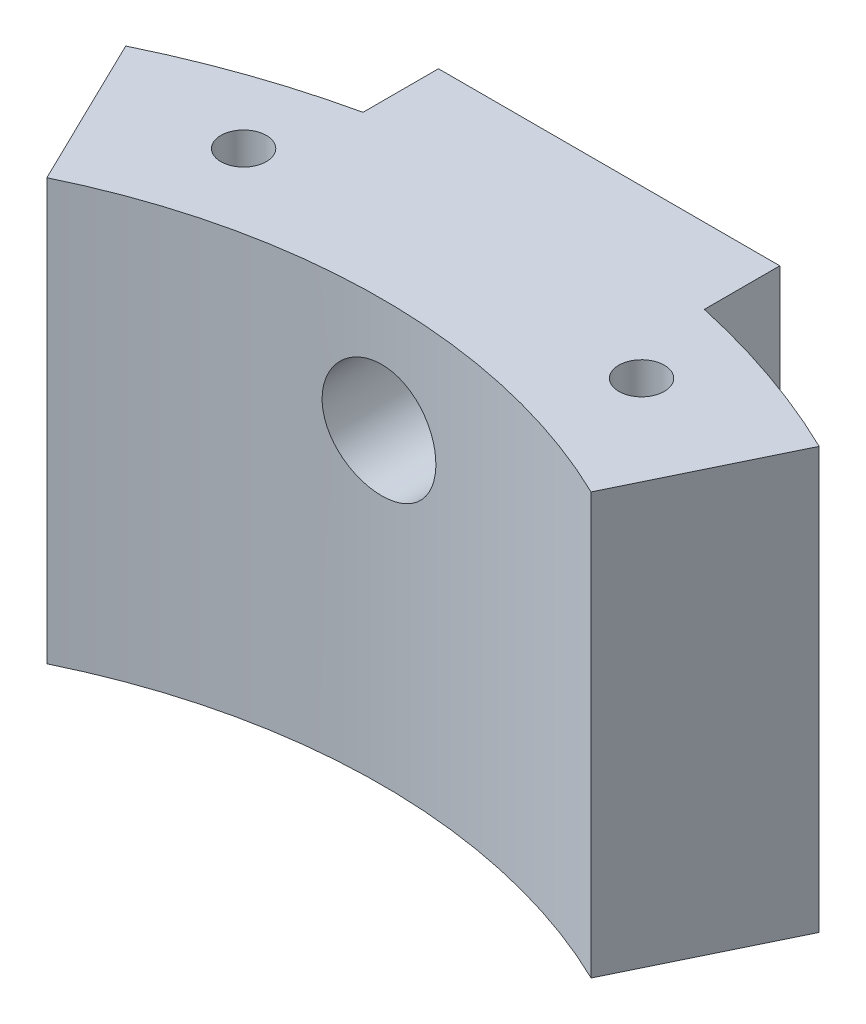
ISO-10303-21;
HEADER;
FILE_DESCRIPTION(('STEP AP214'),'2;1');
FILE_NAME('part.step','',(''),(''),'','','');
FILE_SCHEMA(('AUTOMOTIVE_DESIGN { 1 0 10303 214 1 1 1 1 }'));
ENDSEC;
DATA;
#1=APPLICATION_CONTEXT('core data for automotive mechanical design processes');
#2=APPLICATION_PROTOCOL_DEFINITION('international standard','automotive_design',2000,#1);
#3=PRODUCT_CONTEXT('',#1,'mechanical');
#4=PRODUCT('Part','Part','',(#3));
#5=PRODUCT_RELATED_PRODUCT_CATEGORY('part','',(#4));
#6=PRODUCT_DEFINITION_FORMATION('','',#4);
#7=PRODUCT_DEFINITION_CONTEXT('part definition',#1,'design');
#8=PRODUCT_DEFINITION('design','',#6,#7);
#9=PRODUCT_DEFINITION_SHAPE('','',#8);
#10=(LENGTH_UNIT() NAMED_UNIT(*) SI_UNIT(.MILLI.,.METRE.));
#11=(NAMED_UNIT(*) PLANE_ANGLE_UNIT() SI_UNIT($,.RADIAN.));
#12=(NAMED_UNIT(*) SI_UNIT($,.STERADIAN.) SOLID_ANGLE_UNIT());
#13=UNCERTAINTY_MEASURE_WITH_UNIT(LENGTH_MEASURE(1.E-05),#10,'distance_accuracy_value','');
#14=(GEOMETRIC_REPRESENTATION_CONTEXT(3) GLOBAL_UNCERTAINTY_ASSIGNED_CONTEXT((#13)) GLOBAL_UNIT_ASSIGNED_CONTEXT((#10,
#11,#12)) REPRESENTATION_CONTEXT('',''));
#15=CARTESIAN_POINT('',(0.,0.,0.));
#16=DIRECTION('',(0.,0.,1.));
#17=DIRECTION('',(1.,0.,0.));
#18=AXIS2_PLACEMENT_3D('',#15,#16,#17);
#19=CARTESIAN_POINT('',(15.4748289189094,-11.,-12.0149656788601));
#20=DIRECTION('',(0.,0.,-1.));
#21=DIRECTION('',(-1.,0.,0.));
#22=AXIS2_PLACEMENT_3D('',#19,#20,#21);
#23=PLANE('',#22);
#24=CARTESIAN_POINT('',(30.4748289189094,27.,-12.0149656788601));
#25=DIRECTION('',(0.,0.,-1.));
#26=DIRECTION('',(-1.,0.,0.));
#27=AXIS2_PLACEMENT_3D('',#24,#25,#26);
#28=CIRCLE('',#27,5.);
#29=CARTESIAN_POINT('',(25.4748289189094,27.,-12.0149656788601));
#30=VERTEX_POINT('',#29);
#31=EDGE_CURVE('E248',#30,#30,#28,.T.);
#32=ORIENTED_EDGE('',*,*,#31,.F.);
#33=EDGE_LOOP('',(#32));
#34=FACE_BOUND('',#33,.T.);
#35=DIRECTION('',(-1.,0.,0.));
#36=VECTOR('',#35,1.);
#37=CARTESIAN_POINT('',(15.4748289189094,-11.,-12.0149656788601));
#38=LINE('',#37,#36);
#39=CARTESIAN_POINT('',(35.4748289189093,-11.,-12.0149656788601));
#40=VERTEX_POINT('',#39);
#41=CARTESIAN_POINT('',(25.4748289189094,-11.,-12.0149656788601));
#42=VERTEX_POINT('',#41);
#43=EDGE_CURVE('E400',#40,#42,#38,.T.);
#44=ORIENTED_EDGE('',*,*,#43,.T.);
#45=CARTESIAN_POINT('',(25.4748289189094,-1.,-12.0149656788601));
#46=DIRECTION('',(0.,0.,-1.));
#47=DIRECTION('',(-1.,0.,0.));
#48=AXIS2_PLACEMENT_3D('',#45,#46,#47);
#49=CIRCLE('',#48,10.);
#50=CARTESIAN_POINT('',(15.4748289189094,-1.,-12.0149656788601));
#51=VERTEX_POINT('',#50);
#52=EDGE_CURVE('E44',#42,#51,#49,.T.);
#53=ORIENTED_EDGE('',*,*,#52,.T.);
#54=DIRECTION('',(0.,1.,0.));
#55=VECTOR('',#54,1.);
#56=CARTESIAN_POINT('',(15.4748289189094,-11.,-12.0149656788601));
#57=LINE('',#56,#55);
#58=CARTESIAN_POINT('',(15.4748289189094,37.,-12.0149656788601));
#59=VERTEX_POINT('',#58);
#60=EDGE_CURVE('E397',#51,#59,#57,.T.);
#61=ORIENTED_EDGE('',*,*,#60,.T.);
#62=DIRECTION('',(-1.,0.,0.));
#63=VECTOR('',#62,1.);
#64=CARTESIAN_POINT('',(15.4748289189094,37.,-12.0149656788601));
#65=LINE('',#64,#63);
#66=CARTESIAN_POINT('',(45.4748289189093,37.,-12.0149656788601));
#67=VERTEX_POINT('',#66);
#68=EDGE_CURVE('E435',#67,#59,#65,.T.);
#69=ORIENTED_EDGE('',*,*,#68,.F.);
#70=DIRECTION('',(0.,1.,0.));
#71=VECTOR('',#70,1.);
#72=CARTESIAN_POINT('',(45.4748289189093,-11.,-12.0149656788601));
#73=LINE('',#72,#71);
#74=CARTESIAN_POINT('',(45.4748289189093,-1.,-12.0149656788601));
#75=VERTEX_POINT('',#74);
#76=EDGE_CURVE('E411',#75,#67,#73,.T.);
#77=ORIENTED_EDGE('',*,*,#76,.F.);
#78=CARTESIAN_POINT('',(35.4748289189093,-1.,-12.0149656788601));
#79=DIRECTION('',(0.,0.,-1.));
#80=DIRECTION('',(-1.,0.,0.));
#81=AXIS2_PLACEMENT_3D('',#78,#79,#80);
#82=CIRCLE('',#81,10.);
#83=EDGE_CURVE('E390',#75,#40,#82,.T.);
#84=ORIENTED_EDGE('',*,*,#83,.T.);
#85=EDGE_LOOP('',(#44,#53,#61,#69,#77,#84));
#86=FACE_BOUND('',#85,.T.);
#87=DIRECTION('',(-0.954685740600449,0.297615753437504,0.));
#88=VECTOR('',#87,1.);
#89=CARTESIAN_POINT('',(21.5360680067529,1.45387212850531,-12.0149656788601));
#90=LINE('',#89,#88);
#91=CARTESIAN_POINT('',(26.1997693522259,0.,-12.0149656788601));
#92=VERTEX_POINT('',#91);
#93=CARTESIAN_POINT('',(21.5360680067529,1.45387212850531,-12.0149656788601));
#94=VERTEX_POINT('',#93);
#95=EDGE_CURVE('E237',#92,#94,#90,.T.);
#96=ORIENTED_EDGE('',*,*,#95,.F.);
#97=CARTESIAN_POINT('',(24.0105742608766,1.18454372713471,-12.0149656788601));
#98=DIRECTION('',(0.,0.,-1.));
#99=DIRECTION('',(1.,0.,0.));
#100=AXIS2_PLACEMENT_3D('',#97,#98,#99);
#101=CIRCLE('',#100,2.48912012355412);
#102=EDGE_CURVE('E232',#94,#92,#101,.T.);
#103=ORIENTED_EDGE('',*,*,#102,.F.);
#104=EDGE_LOOP('',(#96,#103));
#105=FACE_BOUND('',#104,.T.);
#106=DIRECTION('',(0.915652207877119,0.40197143456937,0.));
#107=VECTOR('',#106,1.);
#108=CARTESIAN_POINT('',(34.4260203366018,3.67366385068883,-12.0149656788601));
#109=LINE('',#108,#107);
#110=CARTESIAN_POINT('',(34.4260203366018,3.67366385068883,-12.0149656788601));
#111=VERTEX_POINT('',#110);
#112=CARTESIAN_POINT('',(38.9601744224783,5.66415806539064,-12.0149656788601));
#113=VERTEX_POINT('',#112);
#114=EDGE_CURVE('E220',#111,#113,#109,.T.);
#115=ORIENTED_EDGE('',*,*,#114,.F.);
#116=CARTESIAN_POINT('',(36.8827217054915,4.23696500916722,-12.0149656788601));
#117=DIRECTION('',(0.,0.,-1.));
#118=DIRECTION('',(1.,0.,0.));
#119=AXIS2_PLACEMENT_3D('',#116,#117,#118);
#120=CIRCLE('',#119,2.52045428664118);
#121=EDGE_CURVE('E202',#113,#111,#120,.T.);
#122=ORIENTED_EDGE('',*,*,#121,.F.);
#123=EDGE_LOOP('',(#115,#122));
#124=FACE_BOUND('',#123,.T.);
#125=ADVANCED_FACE('F36',(#34,#86,#105,#124),#23,.T.);
#126=CARTESIAN_POINT('',(30.4748289189093,37.,62.6877945256126));
#127=DIRECTION('',(0.,-1.,0.));
#128=DIRECTION('',(0.,0.,-1.));
#129=AXIS2_PLACEMENT_3D('',#126,#127,#128);
#130=CYLINDRICAL_SURFACE('',#129,69.7027602044726);
#131=CARTESIAN_POINT('',(30.4748289189093,37.,62.6877945256126));
#132=DIRECTION('',(0.,1.,0.));
#133=DIRECTION('',(0.,0.,-1.));
#134=AXIS2_PLACEMENT_3D('',#131,#132,#133);
#135=CIRCLE('',#134,69.7027602044726);
#136=CARTESIAN_POINT('',(15.4748289189094,37.,-5.38183732385621));
#137=VERTEX_POINT('',#136);
#138=CARTESIAN_POINT('',(0.,37.,0.));
#139=VERTEX_POINT('',#138);
#140=EDGE_CURVE('E338',#137,#139,#135,.T.);
#141=ORIENTED_EDGE('',*,*,#140,.F.);
#142=DIRECTION('',(0.,-1.,0.));
#143=VECTOR('',#142,1.);
#144=CARTESIAN_POINT('',(15.4748289189094,37.,-5.38183732385621));
#145=LINE('',#144,#143);
#146=CARTESIAN_POINT('',(15.4748289189094,0.,-5.38183732385621));
#147=VERTEX_POINT('',#146);
#148=EDGE_CURVE('E444',#137,#147,#145,.T.);
#149=ORIENTED_EDGE('',*,*,#148,.T.);
#150=CARTESIAN_POINT('',(30.4748289189093,0.,62.6877945256126));
#151=DIRECTION('',(0.,1.,0.));
#152=DIRECTION('',(0.,0.,-1.));
#153=AXIS2_PLACEMENT_3D('',#150,#151,#152);
#154=CIRCLE('',#153,69.7027602044726);
#155=CARTESIAN_POINT('',(0.,0.,0.));
#156=VERTEX_POINT('',#155);
#157=EDGE_CURVE('E356',#147,#156,#154,.T.);
#158=ORIENTED_EDGE('',*,*,#157,.T.);
#159=DIRECTION('',(0.,-1.,0.));
#160=VECTOR('',#159,1.);
#161=CARTESIAN_POINT('',(0.,37.,0.));
#162=LINE('',#161,#160);
#163=EDGE_CURVE('E368',#139,#156,#162,.T.);
#164=ORIENTED_EDGE('',*,*,#163,.F.);
#165=EDGE_LOOP('',(#141,#149,#158,#164));
#166=FACE_BOUND('',#165,.T.);
#167=ADVANCED_FACE('F290',(#166),#130,.T.);
#168=CARTESIAN_POINT('',(60.9496578378187,0.,0.));
#169=VERTEX_POINT('',#168);
#170=CARTESIAN_POINT('',(45.4748289189093,0.,-5.38183732385621));
#171=VERTEX_POINT('',#170);
#172=EDGE_CURVE('E344',#169,#171,#154,.T.);
#173=ORIENTED_EDGE('',*,*,#172,.T.);
#174=DIRECTION('',(0.,-1.,0.));
#175=VECTOR('',#174,1.);
#176=CARTESIAN_POINT('',(45.4748289189093,37.,-5.38183732385621));
#177=LINE('',#176,#175);
#178=CARTESIAN_POINT('',(45.4748289189093,37.,-5.38183732385621));
#179=VERTEX_POINT('',#178);
#180=EDGE_CURVE('E410',#171,#179,#177,.F.);
#181=ORIENTED_EDGE('',*,*,#180,.T.);
#182=CARTESIAN_POINT('',(60.9496578378187,37.,0.));
#183=VERTEX_POINT('',#182);
#184=EDGE_CURVE('E347',#183,#179,#135,.T.);
#185=ORIENTED_EDGE('',*,*,#184,.F.);
#186=DIRECTION('',(0.,-1.,0.));
#187=VECTOR('',#186,1.);
#188=CARTESIAN_POINT('',(60.9496578378187,37.,0.));
#189=LINE('',#188,#187);
#190=EDGE_CURVE('E332',#183,#169,#189,.T.);
#191=ORIENTED_EDGE('',*,*,#190,.T.);
#192=EDGE_LOOP('',(#173,#181,#185,#191));
#193=FACE_BOUND('',#192,.T.);
#194=ADVANCED_FACE('F343',(#193),#130,.T.);
#195=CARTESIAN_POINT('',(0.,37.,0.));
#196=DIRECTION('',(0.899358853820398,0.,-0.437211221327701));
#197=DIRECTION('',(-0.437211221327701,0.,-0.899358853820398));
#198=AXIS2_PLACEMENT_3D('',#195,#196,#197);
#199=PLANE('',#198);
#200=DIRECTION('',(0.437211221327701,0.,0.899358853820398));
#201=VECTOR('',#200,1.);
#202=CARTESIAN_POINT('',(0.,0.,0.));
#203=LINE('',#202,#201);
#204=CARTESIAN_POINT('',(6.55816831991552,0.,13.490382807306));
#205=VERTEX_POINT('',#204);
#206=EDGE_CURVE('E355',#156,#205,#203,.T.);
#207=ORIENTED_EDGE('',*,*,#206,.T.);
#208=DIRECTION('',(0.,-1.,0.));
#209=VECTOR('',#208,1.);
#210=CARTESIAN_POINT('',(6.55816831991552,37.,13.490382807306));
#211=LINE('',#210,#209);
#212=CARTESIAN_POINT('',(6.55816831991552,37.,13.490382807306));
#213=VERTEX_POINT('',#212);
#214=EDGE_CURVE('E365',#213,#205,#211,.T.);
#215=ORIENTED_EDGE('',*,*,#214,.F.);
#216=DIRECTION('',(0.437211221327701,0.,0.899358853820398));
#217=VECTOR('',#216,1.);
#218=CARTESIAN_POINT('',(0.,37.,0.));
#219=LINE('',#218,#217);
#220=EDGE_CURVE('E459',#139,#213,#219,.T.);
#221=ORIENTED_EDGE('',*,*,#220,.F.);
#222=ORIENTED_EDGE('',*,*,#163,.T.);
#223=EDGE_LOOP('',(#207,#215,#221,#222));
#224=FACE_BOUND('',#223,.T.);
#225=ADVANCED_FACE('F324',(#224),#199,.F.);
#226=CARTESIAN_POINT('',(30.4748289189093,37.,62.6877945256126));
#227=DIRECTION('',(0.,-1.,0.));
#228=DIRECTION('',(0.,0.,-1.));
#229=AXIS2_PLACEMENT_3D('',#226,#227,#228);
#230=CYLINDRICAL_SURFACE('',#229,54.7027602044726);
#231=CARTESIAN_POINT('',(25.4748289189094,27.,8.21402125821319));
#232=CARTESIAN_POINT('',(25.4748276048518,27.1401607877434,8.2140215909253));
#233=CARTESIAN_POINT('',(25.4807246908093,27.2803012863966,8.21347919280099));
#234=CARTESIAN_POINT('',(25.5042696858648,27.5596285346675,8.21132565719468));
#235=CARTESIAN_POINT('',(25.5219204585061,27.6988150435148,8.2097142592733));
#236=CARTESIAN_POINT('',(25.5688676071137,27.9753076615766,8.20546646506004));
#237=CARTESIAN_POINT('',(25.5981734491418,28.1126121482414,8.20282923564244));
#238=CARTESIAN_POINT('',(25.6682297578164,28.3843018983357,8.19660427819984));
#239=CARTESIAN_POINT('',(25.7089844120897,28.5186860741914,8.19301620241146));
#240=CARTESIAN_POINT('',(25.8015944311176,28.783402318136,8.18499634506034));
#241=CARTESIAN_POINT('',(25.8534391424353,28.9137381385489,8.18056537365713));
#242=CARTESIAN_POINT('',(25.9679010690671,29.1696204442498,8.17098177273786));
#243=CARTESIAN_POINT('',(26.0305222506401,29.2951651453165,8.16582887764944));
#244=CARTESIAN_POINT('',(26.1660375417723,29.540460420623,8.15495206969041));
#245=CARTESIAN_POINT('',(26.2389256756988,29.6602143111857,8.14922848953544));
#246=CARTESIAN_POINT('',(26.3945146894834,29.8932104835286,8.13736742809967));
#247=CARTESIAN_POINT('',(26.4772191925119,30.0064503379738,8.1312297943569));
#248=CARTESIAN_POINT('',(26.6520418824429,30.2258361268487,8.11870099790296));
#249=CARTESIAN_POINT('',(26.7441817383142,30.3319647622021,8.1123092732055));
#250=CARTESIAN_POINT('',(26.9370990633889,30.5361277869416,8.09946438476115));
#251=CARTESIAN_POINT('',(27.0378797122748,30.6341591703808,8.0930111991808));
#252=CARTESIAN_POINT('',(27.2473063062993,30.8213633044453,8.08023029763465));
#253=CARTESIAN_POINT('',(27.355949695265,30.9105389119127,8.07390254173636));
#254=CARTESIAN_POINT('',(27.5804084391383,31.079469015481,8.06154680512048));
#255=CARTESIAN_POINT('',(27.6962264258613,31.1592200228448,8.05551893588808));
#256=CARTESIAN_POINT('',(27.9343487603831,31.3087998035412,8.04392790802454));
#257=CARTESIAN_POINT('',(28.0566618491129,31.3786147153448,8.03836540297882));
#258=CARTESIAN_POINT('',(28.3068050759368,31.507714837228,8.02787021100007));
#259=CARTESIAN_POINT('',(28.4346372396979,31.5669961396086,8.02293775799015));
#260=CARTESIAN_POINT('',(28.6948318323768,31.6745490669847,8.01384732236249));
#261=CARTESIAN_POINT('',(28.8271924938915,31.7228249321115,8.0096890415883));
#262=CARTESIAN_POINT('',(29.0955473526369,31.8080599953127,8.00226042374573));
#263=CARTESIAN_POINT('',(29.2315428687133,31.8450150235058,7.99899041391036));
#264=CARTESIAN_POINT('',(29.6426619391312,31.9382293863215,7.99068275068988));
#265=CARTESIAN_POINT('',(29.9219437591369,31.9772607194632,7.98711052156395));
#266=CARTESIAN_POINT('',(30.4829636887081,32.0078906067595,7.98431433579434));
#267=CARTESIAN_POINT('',(30.7647017441393,31.9994902036638,7.98509028355939));
#268=CARTESIAN_POINT('',(31.3219356532859,31.9356634673644,7.99088645418653));
#269=CARTESIAN_POINT('',(31.5974476346299,31.880377633094,7.99589399630893));
#270=CARTESIAN_POINT('',(32.1352545449236,31.724551528144,8.0095777460507));
#271=CARTESIAN_POINT('',(32.3975493266439,31.6240107534835,8.01825399452649));
#272=CARTESIAN_POINT('',(32.9019347790567,31.3803777097497,8.03832066429947));
#273=CARTESIAN_POINT('',(33.1439950541824,31.2372228479261,8.04971507318167));
#274=CARTESIAN_POINT('',(33.6007049823343,30.9124695337287,8.07393860888604));
#275=CARTESIAN_POINT('',(33.8153539646082,30.730870140909,8.0867677708021));
#276=CARTESIAN_POINT('',(34.2119715433798,30.3335917195921,8.11247531896193));
#277=CARTESIAN_POINT('',(34.3938177765908,30.1177905091835,8.12535371367177));
#278=CARTESIAN_POINT('',(34.7187213848105,29.658658962344,8.14966125784077));
#279=CARTESIAN_POINT('',(34.8617787175984,29.4153285959487,8.16109040572244));
#280=CARTESIAN_POINT('',(35.1050409391446,28.9079563509991,8.18120699240986));
#281=CARTESIAN_POINT('',(35.2052389200454,28.6439111418392,8.18989398919024));
#282=CARTESIAN_POINT('',(35.3598446972483,28.1026479927218,8.20353375498562));
#283=CARTESIAN_POINT('',(35.4142536550014,27.8254303870741,8.20848661871759));
#284=CARTESIAN_POINT('',(35.4755808654073,27.2667639838298,8.21408144021092));
#285=CARTESIAN_POINT('',(35.4826700095024,26.985334094616,8.21473891023475));
#286=CARTESIAN_POINT('',(35.4496045304988,26.4252901531356,8.21170943822144));
#287=CARTESIAN_POINT('',(35.4094504390722,26.1466760692156,8.20802254507547));
#288=CARTESIAN_POINT('',(35.2831810384817,25.6006666370978,8.19673389127385));
#289=CARTESIAN_POINT('',(35.1971459662383,25.3332525800804,8.18913896581898));
#290=CARTESIAN_POINT('',(34.9816384788656,24.8166536461467,8.17089560753934));
#291=CARTESIAN_POINT('',(34.8521652283897,24.5674691199092,8.16024711599294));
#292=CARTESIAN_POINT('',(34.553026494452,24.0936220627489,8.13705884289101));
#293=CARTESIAN_POINT('',(34.383247426546,23.8690315015272,8.12451375355783));
#294=CARTESIAN_POINT('',(34.0084789291442,23.4514762890789,8.09896348950991));
#295=CARTESIAN_POINT('',(33.8034887714483,23.2585122920821,8.08595830528437));
#296=CARTESIAN_POINT('',(33.3633809431563,22.9091012769481,8.06090662837028));
#297=CARTESIAN_POINT('',(33.1281747716057,22.7527654986128,8.04886312748738));
#298=CARTESIAN_POINT('',(32.634736764291,22.4818144408063,8.02713541755599));
#299=CARTESIAN_POINT('',(32.3765051984769,22.3671986722893,8.01745118085243));
#300=CARTESIAN_POINT('',(31.8447928447886,22.1831256508198,8.00154562989178));
#301=CARTESIAN_POINT('',(31.5713357128789,22.1136003556586,7.99531909995354));
#302=CARTESIAN_POINT('',(31.0164162604002,22.0214795935231,7.98701356144928));
#303=CARTESIAN_POINT('',(30.7349541253728,21.9988830397214,7.98493445683268));
#304=CARTESIAN_POINT('',(30.3137088282019,22.0006227975982,7.98509013494663));
#305=CARTESIAN_POINT('',(30.1736319021623,22.0071105623984,7.98568488026597));
#306=CARTESIAN_POINT('',(29.8945389376928,22.0318161671919,7.98793491686202));
#307=CARTESIAN_POINT('',(29.7555225251875,22.0500296572989,7.98958981485333));
#308=CARTESIAN_POINT('',(29.479484438485,22.0980683745303,7.99391602943669));
#309=CARTESIAN_POINT('',(29.3424635157068,22.1278978641726,7.99658771913464));
#310=CARTESIAN_POINT('',(29.0714772739765,22.198936208534,8.0028703207507));
#311=CARTESIAN_POINT('',(28.937510855153,22.2401408948913,8.00648088859535));
#312=CARTESIAN_POINT('',(28.6734958190527,22.3336505136457,8.01454125130656));
#313=CARTESIAN_POINT('',(28.5434482741948,22.3859584535596,8.01899127351807));
#314=CARTESIAN_POINT('',(28.2882704897387,22.5012715072838,8.02860285537622));
#315=CARTESIAN_POINT('',(28.1631384704891,22.5642727048473,8.03376415439861));
#316=CARTESIAN_POINT('',(27.9185760286981,22.7005611459397,8.04465648133088));
#317=CARTESIAN_POINT('',(27.7991476182705,22.7738519840368,8.05038770813353));
#318=CARTESIAN_POINT('',(27.5669170374431,22.9301557799949,8.06225527659833));
#319=CARTESIAN_POINT('',(27.4541124733257,23.0131651928963,8.06839147019015));
#320=CARTESIAN_POINT('',(27.2354472515275,23.1886829807069,8.08092295918718));
#321=CARTESIAN_POINT('',(27.1296151219949,23.281226834587,8.08731916448841));
#322=CARTESIAN_POINT('',(26.9261555457928,23.4748571188658,8.10016515165416));
#323=CARTESIAN_POINT('',(26.8285251136932,23.5759404137882,8.10661491307656));
#324=CARTESIAN_POINT('',(26.6420555601694,23.7860324107051,8.11939190926004));
#325=CARTESIAN_POINT('',(26.553221837684,23.8950459095069,8.1257190668812));
#326=CARTESIAN_POINT('',(26.38507257572,24.1201352891808,8.13806515995964));
#327=CARTESIAN_POINT('',(26.3057535348466,24.2362085482225,8.14408420833052));
#328=CARTESIAN_POINT('',(26.15696853018,24.4749426814878,8.15566050882028));
#329=CARTESIAN_POINT('',(26.0875282524443,24.5976196256275,8.1612165420622));
#330=CARTESIAN_POINT('',(25.9592643782628,24.8483721282123,8.17168872406366));
#331=CARTESIAN_POINT('',(25.9004368961848,24.9764456895372,8.17660510683204));
#332=CARTESIAN_POINT('',(25.7938361730233,25.2370185846613,8.18565563664364));
#333=CARTESIAN_POINT('',(25.7460537510208,25.369514137183,8.18979043283553));
#334=CARTESIAN_POINT('',(25.6618391053864,25.6380418720715,8.19716335307744));
#335=CARTESIAN_POINT('',(25.6254040612425,25.7740731664693,8.20040169992725));
#336=CARTESIAN_POINT('',(25.5549592552857,26.0898906249832,8.20671081653823));
#337=CARTESIAN_POINT('',(25.5249386941168,26.2705877350205,8.20944138604917));
#338=CARTESIAN_POINT('',(25.4848744167556,26.6342014157818,8.21309638679307));
#339=CARTESIAN_POINT('',(25.4748306334938,26.8171179790522,8.21402082408989));
#340=CARTESIAN_POINT('',(25.4748289189094,27.,8.21402125821319));
#341=B_SPLINE_CURVE_WITH_KNOTS('',3,(#231,#232,#233,#234,#235,#236,#237,#238,#239,#240,#241,
#242,#243,#244,#245,#246,#247,#248,#249,#250,#251,#252,#253,#254,#255,#256,#257,#258,#259,#260,
#261,#262,#263,#264,#265,#266,#267,#268,#269,#270,#271,#272,#273,#274,#275,#276,#277,#278,#279,
#280,#281,#282,#283,#284,#285,#286,#287,#288,#289,#290,#291,#292,#293,#294,#295,#296,#297,#298,
#299,#300,#301,#302,#303,#304,#305,#306,#307,#308,#309,#310,#311,#312,#313,#314,#315,#316,#317,
#318,#319,#320,#321,#322,#323,#324,#325,#326,#327,#328,#329,#330,#331,#332,#333,#334,#335,#336,
#337,#338,#339,#340),.UNSPECIFIED.,.T.,.F.,(4,2,2,2,2,2,2,2,2,2,2,2,2,2,2,2,2,2,2,2,2,2,2,2,2,2,
2,2,2,2,2,2,2,2,2,2,2,2,2,2,2,2,2,2,2,2,2,2,2,2,2,2,2,2,4),(0.,0.420322459953338,
0.840747360284781,1.26151442264368,1.68243558961567,2.10295420870306,2.5236279311548,
2.94405781457686,3.36464336186843,3.78621745050239,4.20794734343549,4.62954074279721,
5.05128971921607,5.47362141480195,5.89610945899359,6.31843445252789,6.74091481739165,
7.58258767734636,8.42424203385372,9.26338312809916,10.1025335676559,10.9429227080554,
11.7833324087765,12.6268150087052,13.4702985267423,14.3139179420844,15.1575159581442,
15.9980657363362,16.8386060551281,17.6776812295931,18.5167725409864,19.3582571389842,
20.1997591418094,21.043784582736,21.8878001295977,22.7305390623494,23.5732584778086,
23.9935346753138,24.4136550529425,24.8339297402084,25.2540506246943,25.6742854520573,
26.0943667054397,26.5145950762487,26.9346706388014,27.3563700540626,27.7779152989223,
28.1997176821684,28.6213643631748,29.0440880904015,29.4666567315075,29.8888728500957,
30.310983938447,30.8594232005575,31.4078606213485),.UNSPECIFIED.);
#342=CARTESIAN_POINT('',(25.4748289189094,27.,8.21402125821319));
#343=VERTEX_POINT('',#342);
#344=EDGE_CURVE('E251',#343,#343,#341,.T.);
#345=ORIENTED_EDGE('',*,*,#344,.T.);
#346=EDGE_LOOP('',(#345));
#347=FACE_BOUND('',#346,.T.);
#348=CARTESIAN_POINT('',(30.4748289189093,0.,62.6877945256126));
#349=DIRECTION('',(0.,-1.,0.));
#350=DIRECTION('',(0.,0.,-1.));
#351=AXIS2_PLACEMENT_3D('',#348,#349,#350);
#352=CIRCLE('',#351,54.7027602044726);
#353=CARTESIAN_POINT('',(54.3914895179032,0.,13.490382807306));
#354=VERTEX_POINT('',#353);
#355=EDGE_CURVE('E339',#205,#354,#352,.T.);
#356=ORIENTED_EDGE('',*,*,#355,.T.);
#357=DIRECTION('',(0.,-1.,0.));
#358=VECTOR('',#357,1.);
#359=CARTESIAN_POINT('',(54.3914895179032,37.,13.490382807306));
#360=LINE('',#359,#358);
#361=CARTESIAN_POINT('',(54.3914895179032,37.,13.490382807306));
#362=VERTEX_POINT('',#361);
#363=EDGE_CURVE('E335',#362,#354,#360,.T.);
#364=ORIENTED_EDGE('',*,*,#363,.F.);
#365=CARTESIAN_POINT('',(30.4748289189093,37.,62.6877945256126));
#366=DIRECTION('',(0.,-1.,0.));
#367=DIRECTION('',(0.,0.,-1.));
#368=AXIS2_PLACEMENT_3D('',#365,#366,#367);
#369=CIRCLE('',#368,54.7027602044726);
#370=EDGE_CURVE('E460',#213,#362,#369,.T.);
#371=ORIENTED_EDGE('',*,*,#370,.F.);
#372=ORIENTED_EDGE('',*,*,#214,.T.);
#373=EDGE_LOOP('',(#356,#364,#371,#372));
#374=FACE_BOUND('',#373,.T.);
#375=ADVANCED_FACE('F262',(#347,#374),#230,.F.);
#376=CARTESIAN_POINT('',(60.9496578378187,37.,0.));
#377=DIRECTION('',(-0.899358853820398,0.,-0.437211221327701));
#378=DIRECTION('',(-0.437211221327701,0.,0.899358853820398));
#379=AXIS2_PLACEMENT_3D('',#376,#377,#378);
#380=PLANE('',#379);
#381=DIRECTION('',(0.437211221327701,0.,-0.899358853820398));
#382=VECTOR('',#381,1.);
#383=CARTESIAN_POINT('',(60.9496578378187,0.,0.));
#384=LINE('',#383,#382);
#385=EDGE_CURVE('E329',#354,#169,#384,.T.);
#386=ORIENTED_EDGE('',*,*,#385,.T.);
#387=ORIENTED_EDGE('',*,*,#190,.F.);
#388=DIRECTION('',(0.437211221327701,0.,-0.899358853820398));
#389=VECTOR('',#388,1.);
#390=CARTESIAN_POINT('',(60.9496578378187,37.,0.));
#391=LINE('',#390,#389);
#392=EDGE_CURVE('E348',#362,#183,#391,.T.);
#393=ORIENTED_EDGE('',*,*,#392,.F.);
#394=ORIENTED_EDGE('',*,*,#363,.T.);
#395=EDGE_LOOP('',(#386,#387,#393,#394));
#396=FACE_BOUND('',#395,.T.);
#397=ADVANCED_FACE('F315',(#396),#380,.F.);
#398=CARTESIAN_POINT('',(30.4748289189093,37.,62.6877945256126));
#399=DIRECTION('',(0.,-1.,0.));
#400=DIRECTION('',(0.,0.,-1.));
#401=AXIS2_PLACEMENT_3D('',#398,#399,#400);
#402=PLANE('',#401);
#403=ORIENTED_EDGE('',*,*,#184,.T.);
#404=DIRECTION('',(0.,0.,-1.));
#405=VECTOR('',#404,1.);
#406=CARTESIAN_POINT('',(45.4748289189093,37.,-12.0149656788601));
#407=LINE('',#406,#405);
#408=EDGE_CURVE('E438',#179,#67,#407,.T.);
#409=ORIENTED_EDGE('',*,*,#408,.T.);
#410=ORIENTED_EDGE('',*,*,#68,.T.);
#411=DIRECTION('',(0.,0.,1.));
#412=VECTOR('',#411,1.);
#413=CARTESIAN_POINT('',(15.4748289189094,37.,-12.0149656788601));
#414=LINE('',#413,#412);
#415=EDGE_CURVE('E408',#59,#137,#414,.T.);
#416=ORIENTED_EDGE('',*,*,#415,.T.);
#417=ORIENTED_EDGE('',*,*,#140,.T.);
#418=ORIENTED_EDGE('',*,*,#220,.T.);
#419=ORIENTED_EDGE('',*,*,#370,.T.);
#420=ORIENTED_EDGE('',*,*,#392,.T.);
#421=EDGE_LOOP('',(#403,#409,#410,#416,#417,#418,#419,#420));
#422=FACE_BOUND('',#421,.T.);
#423=CARTESIAN_POINT('',(12.9859488733858,37.,2.62235908113962));
#424=DIRECTION('',(0.,1.,0.));
#425=DIRECTION('',(0.,0.,1.));
#426=AXIS2_PLACEMENT_3D('',#423,#424,#425);
#427=CIRCLE('',#426,2.);
#428=CARTESIAN_POINT('',(12.9859488733858,37.,4.62235908113962));
#429=VERTEX_POINT('',#428);
#430=EDGE_CURVE('E450',#429,#429,#427,.T.);
#431=ORIENTED_EDGE('',*,*,#430,.F.);
#432=EDGE_LOOP('',(#431));
#433=FACE_BOUND('',#432,.T.);
#434=CARTESIAN_POINT('',(47.9637089644329,37.,2.62235908113962));
#435=DIRECTION('',(0.,1.,0.));
#436=DIRECTION('',(0.,0.,-1.));
#437=AXIS2_PLACEMENT_3D('',#434,#435,#436);
#438=CIRCLE('',#437,2.);
#439=CARTESIAN_POINT('',(47.9637089644329,37.,0.622359081139617));
#440=VERTEX_POINT('',#439);
#441=EDGE_CURVE('E447',#440,#440,#438,.T.);
#442=ORIENTED_EDGE('',*,*,#441,.F.);
#443=EDGE_LOOP('',(#442));
#444=FACE_BOUND('',#443,.T.);
#445=ADVANCED_FACE('F312',(#422,#433,#444),#402,.F.);
#446=CARTESIAN_POINT('',(30.4748289189093,0.,62.6877945256126));
#447=DIRECTION('',(0.,-1.,0.));
#448=DIRECTION('',(0.,0.,-1.));
#449=AXIS2_PLACEMENT_3D('',#446,#447,#448);
#450=PLANE('',#449);
#451=ORIENTED_EDGE('',*,*,#157,.F.);
#452=DIRECTION('',(0.,0.,1.));
#453=VECTOR('',#452,1.);
#454=CARTESIAN_POINT('',(15.4748289189094,0.,-8.11841441130388));
#455=LINE('',#454,#453);
#456=CARTESIAN_POINT('',(15.4748289189094,0.,-8.11841441130388));
#457=VERTEX_POINT('',#456);
#458=EDGE_CURVE('E425',#457,#147,#455,.T.);
#459=ORIENTED_EDGE('',*,*,#458,.F.);
#460=DIRECTION('',(-1.,0.,0.));
#461=VECTOR('',#460,1.);
#462=CARTESIAN_POINT('',(45.4748289189093,0.,-8.11841441130388));
#463=LINE('',#462,#461);
#464=CARTESIAN_POINT('',(45.4748289189093,0.,-8.11841441130388));
#465=VERTEX_POINT('',#464);
#466=EDGE_CURVE('E427',#465,#457,#463,.T.);
#467=ORIENTED_EDGE('',*,*,#466,.F.);
#468=DIRECTION('',(0.,0.,1.));
#469=VECTOR('',#468,1.);
#470=CARTESIAN_POINT('',(45.4748289189093,0.,-8.11841441130388));
#471=LINE('',#470,#469);
#472=EDGE_CURVE('E354',#465,#171,#471,.T.);
#473=ORIENTED_EDGE('',*,*,#472,.T.);
#474=ORIENTED_EDGE('',*,*,#172,.F.);
#475=ORIENTED_EDGE('',*,*,#385,.F.);
#476=ORIENTED_EDGE('',*,*,#355,.F.);
#477=ORIENTED_EDGE('',*,*,#206,.F.);
#478=EDGE_LOOP('',(#451,#459,#467,#473,#474,#475,#476,#477));
#479=FACE_BOUND('',#478,.T.);
#480=CARTESIAN_POINT('',(12.9859488733858,0.,2.62235908113962));
#481=DIRECTION('',(0.,1.,0.));
#482=DIRECTION('',(0.,0.,1.));
#483=AXIS2_PLACEMENT_3D('',#480,#481,#482);
#484=CIRCLE('',#483,2.);
#485=CARTESIAN_POINT('',(12.9859488733858,0.,4.62235908113962));
#486=VERTEX_POINT('',#485);
#487=EDGE_CURVE('E359',#486,#486,#484,.T.);
#488=ORIENTED_EDGE('',*,*,#487,.T.);
#489=EDGE_LOOP('',(#488));
#490=FACE_BOUND('',#489,.T.);
#491=CARTESIAN_POINT('',(47.9637089644329,0.,2.62235908113962));
#492=DIRECTION('',(0.,1.,0.));
#493=DIRECTION('',(0.,0.,-1.));
#494=AXIS2_PLACEMENT_3D('',#491,#492,#493);
#495=CIRCLE('',#494,2.);
#496=CARTESIAN_POINT('',(47.9637089644329,0.,0.622359081139617));
#497=VERTEX_POINT('',#496);
#498=EDGE_CURVE('E453',#497,#497,#495,.T.);
#499=ORIENTED_EDGE('',*,*,#498,.T.);
#500=EDGE_LOOP('',(#499));
#501=FACE_BOUND('',#500,.T.);
#502=ADVANCED_FACE('F310',(#479,#490,#501),#450,.T.);
#503=CARTESIAN_POINT('',(47.9637089644329,0.,2.62235908113962));
#504=DIRECTION('',(0.,1.,0.));
#505=DIRECTION('',(0.,0.,1.));
#506=AXIS2_PLACEMENT_3D('',#503,#504,#505);
#507=CYLINDRICAL_SURFACE('',#506,2.);
#508=ORIENTED_EDGE('',*,*,#498,.F.);
#509=EDGE_LOOP('',(#508));
#510=FACE_BOUND('',#509,.T.);
#511=ORIENTED_EDGE('',*,*,#441,.T.);
#512=EDGE_LOOP('',(#511));
#513=FACE_BOUND('',#512,.T.);
#514=ADVANCED_FACE('F306',(#510,#513),#507,.F.);
#515=CARTESIAN_POINT('',(12.9859488733858,0.,2.62235908113962));
#516=DIRECTION('',(0.,1.,0.));
#517=DIRECTION('',(0.,0.,1.));
#518=AXIS2_PLACEMENT_3D('',#515,#516,#517);
#519=CYLINDRICAL_SURFACE('',#518,2.);
#520=ORIENTED_EDGE('',*,*,#487,.F.);
#521=EDGE_LOOP('',(#520));
#522=FACE_BOUND('',#521,.T.);
#523=ORIENTED_EDGE('',*,*,#430,.T.);
#524=EDGE_LOOP('',(#523));
#525=FACE_BOUND('',#524,.T.);
#526=ADVANCED_FACE('F302',(#522,#525),#519,.F.);
#527=CARTESIAN_POINT('',(15.4748289189094,-11.,-12.0149656788601));
#528=DIRECTION('',(-1.,0.,0.));
#529=DIRECTION('',(0.,0.,1.));
#530=AXIS2_PLACEMENT_3D('',#527,#528,#529);
#531=PLANE('',#530);
#532=ORIENTED_EDGE('',*,*,#60,.F.);
#533=DIRECTION('',(0.,0.,1.));
#534=VECTOR('',#533,1.);
#535=CARTESIAN_POINT('',(15.4748289189094,-1.,-12.0149656788601));
#536=LINE('',#535,#534);
#537=CARTESIAN_POINT('',(15.4748289189094,-1.,-8.11841441130388));
#538=VERTEX_POINT('',#537);
#539=EDGE_CURVE('E371',#51,#538,#536,.T.);
#540=ORIENTED_EDGE('',*,*,#539,.T.);
#541=DIRECTION('',(0.,-1.,0.));
#542=VECTOR('',#541,1.);
#543=CARTESIAN_POINT('',(15.4748289189094,0.,-8.11841441130388));
#544=LINE('',#543,#542);
#545=EDGE_CURVE('E420',#457,#538,#544,.T.);
#546=ORIENTED_EDGE('',*,*,#545,.F.);
#547=ORIENTED_EDGE('',*,*,#458,.T.);
#548=ORIENTED_EDGE('',*,*,#148,.F.);
#549=ORIENTED_EDGE('',*,*,#415,.F.);
#550=EDGE_LOOP('',(#532,#540,#546,#547,#548,#549));
#551=FACE_BOUND('',#550,.T.);
#552=ADVANCED_FACE('F295',(#551),#531,.T.);
#553=CARTESIAN_POINT('',(45.4748289189093,-11.,-12.0149656788601));
#554=DIRECTION('',(1.,0.,0.));
#555=DIRECTION('',(0.,0.,-1.));
#556=AXIS2_PLACEMENT_3D('',#553,#554,#555);
#557=PLANE('',#556);
#558=DIRECTION('',(0.,1.,0.));
#559=VECTOR('',#558,1.);
#560=CARTESIAN_POINT('',(45.4748289189093,0.,-8.11841441130388));
#561=LINE('',#560,#559);
#562=CARTESIAN_POINT('',(45.4748289189093,-1.,-8.11841441130388));
#563=VERTEX_POINT('',#562);
#564=EDGE_CURVE('E260',#563,#465,#561,.T.);
#565=ORIENTED_EDGE('',*,*,#564,.F.);
#566=DIRECTION('',(0.,0.,-1.));
#567=VECTOR('',#566,1.);
#568=CARTESIAN_POINT('',(45.4748289189093,-1.,-12.0149656788601));
#569=LINE('',#568,#567);
#570=EDGE_CURVE('E11',#563,#75,#569,.T.);
#571=ORIENTED_EDGE('',*,*,#570,.T.);
#572=ORIENTED_EDGE('',*,*,#76,.T.);
#573=ORIENTED_EDGE('',*,*,#408,.F.);
#574=ORIENTED_EDGE('',*,*,#180,.F.);
#575=ORIENTED_EDGE('',*,*,#472,.F.);
#576=EDGE_LOOP('',(#565,#571,#572,#573,#574,#575));
#577=FACE_BOUND('',#576,.T.);
#578=ADVANCED_FACE('F292',(#577),#557,.T.);
#579=CARTESIAN_POINT('',(45.4748289189093,-11.,-4.11841441130388));
#580=DIRECTION('',(0.,0.,1.));
#581=DIRECTION('',(1.,0.,0.));
#582=AXIS2_PLACEMENT_3D('',#579,#580,#581);
#583=PLANE('',#582);
#584=DIRECTION('',(1.,0.,0.));
#585=VECTOR('',#584,1.);
#586=CARTESIAN_POINT('',(45.4748289189093,-6.,-4.11841441130388));
#587=LINE('',#586,#585);
#588=CARTESIAN_POINT('',(16.814574881065,-6.,-4.11841441130388));
#589=VERTEX_POINT('',#588);
#590=CARTESIAN_POINT('',(44.1350829567537,-6.,-4.11841441130388));
#591=VERTEX_POINT('',#590);
#592=EDGE_CURVE('E259',#589,#591,#587,.T.);
#593=ORIENTED_EDGE('',*,*,#592,.F.);
#594=CARTESIAN_POINT('',(25.4748289189094,-1.,-4.11841441130388));
#595=DIRECTION('',(0.,0.,1.));
#596=DIRECTION('',(1.,0.,0.));
#597=AXIS2_PLACEMENT_3D('',#594,#595,#596);
#598=CIRCLE('',#597,10.);
#599=CARTESIAN_POINT('',(25.4748289189094,-11.,-4.11841441130388));
#600=VERTEX_POINT('',#599);
#601=EDGE_CURVE('E384',#589,#600,#598,.T.);
#602=ORIENTED_EDGE('',*,*,#601,.T.);
#603=DIRECTION('',(1.,0.,0.));
#604=VECTOR('',#603,1.);
#605=CARTESIAN_POINT('',(45.4748289189093,-11.,-4.11841441130388));
#606=LINE('',#605,#604);
#607=CARTESIAN_POINT('',(35.4748289189093,-11.,-4.11841441130388));
#608=VERTEX_POINT('',#607);
#609=EDGE_CURVE('E432',#600,#608,#606,.T.);
#610=ORIENTED_EDGE('',*,*,#609,.T.);
#611=CARTESIAN_POINT('',(35.4748289189093,-1.,-4.11841441130388));
#612=DIRECTION('',(0.,0.,1.));
#613=DIRECTION('',(1.,0.,0.));
#614=AXIS2_PLACEMENT_3D('',#611,#612,#613);
#615=CIRCLE('',#614,10.);
#616=EDGE_CURVE('E382',#608,#591,#615,.T.);
#617=ORIENTED_EDGE('',*,*,#616,.T.);
#618=EDGE_LOOP('',(#593,#602,#610,#617));
#619=FACE_BOUND('',#618,.T.);
#620=ADVANCED_FACE('F286',(#619),#583,.T.);
#621=CARTESIAN_POINT('',(0.,-11.,0.));
#622=DIRECTION('',(0.,-1.,0.));
#623=DIRECTION('',(0.,0.,-1.));
#624=AXIS2_PLACEMENT_3D('',#621,#622,#623);
#625=PLANE('',#624);
#626=ORIENTED_EDGE('',*,*,#609,.F.);
#627=DIRECTION('',(0.,0.,1.));
#628=VECTOR('',#627,1.);
#629=CARTESIAN_POINT('',(25.4748289189094,-11.,0.));
#630=LINE('',#629,#628);
#631=EDGE_CURVE('E388',#600,#42,#630,.F.);
#632=ORIENTED_EDGE('',*,*,#631,.T.);
#633=ORIENTED_EDGE('',*,*,#43,.F.);
#634=DIRECTION('',(0.,0.,-1.));
#635=VECTOR('',#634,1.);
#636=CARTESIAN_POINT('',(35.4748289189093,-11.,0.));
#637=LINE('',#636,#635);
#638=EDGE_CURVE('E386',#40,#608,#637,.F.);
#639=ORIENTED_EDGE('',*,*,#638,.T.);
#640=EDGE_LOOP('',(#626,#632,#633,#639));
#641=FACE_BOUND('',#640,.T.);
#642=ADVANCED_FACE('F282',(#641),#625,.T.);
#643=CARTESIAN_POINT('',(45.4748289189093,-6.,-8.11841441130388));
#644=DIRECTION('',(0.,-1.,0.));
#645=DIRECTION('',(1.,0.,0.));
#646=AXIS2_PLACEMENT_3D('',#643,#644,#645);
#647=PLANE('',#646);
#648=DIRECTION('',(1.,0.,0.));
#649=VECTOR('',#648,1.);
#650=CARTESIAN_POINT('',(45.4748289189093,-6.,-8.11841441130388));
#651=LINE('',#650,#649);
#652=CARTESIAN_POINT('',(16.814574881065,-6.,-8.11841441130388));
#653=VERTEX_POINT('',#652);
#654=CARTESIAN_POINT('',(44.1350829567537,-6.,-8.11841441130388));
#655=VERTEX_POINT('',#654);
#656=EDGE_CURVE('E417',#653,#655,#651,.T.);
#657=ORIENTED_EDGE('',*,*,#656,.F.);
#658=DIRECTION('',(0.,0.,1.));
#659=VECTOR('',#658,1.);
#660=CARTESIAN_POINT('',(16.814574881065,-6.,-8.11841441130388));
#661=LINE('',#660,#659);
#662=EDGE_CURVE('E380',#653,#589,#661,.T.);
#663=ORIENTED_EDGE('',*,*,#662,.T.);
#664=ORIENTED_EDGE('',*,*,#592,.T.);
#665=DIRECTION('',(0.,0.,-1.));
#666=VECTOR('',#665,1.);
#667=CARTESIAN_POINT('',(44.1350829567537,-6.,-4.11841441130388));
#668=LINE('',#667,#666);
#669=EDGE_CURVE('E378',#591,#655,#668,.T.);
#670=ORIENTED_EDGE('',*,*,#669,.T.);
#671=EDGE_LOOP('',(#657,#663,#664,#670));
#672=FACE_BOUND('',#671,.T.);
#673=ADVANCED_FACE('F278',(#672),#647,.F.);
#674=CARTESIAN_POINT('',(0.,0.,-8.11841441130388));
#675=DIRECTION('',(0.,0.,-1.));
#676=DIRECTION('',(-1.,0.,0.));
#677=AXIS2_PLACEMENT_3D('',#674,#675,#676);
#678=PLANE('',#677);
#679=ORIENTED_EDGE('',*,*,#545,.T.);
#680=CARTESIAN_POINT('',(25.4748289189094,-1.,-8.11841441130388));
#681=DIRECTION('',(0.,0.,-1.));
#682=DIRECTION('',(-1.,0.,0.));
#683=AXIS2_PLACEMENT_3D('',#680,#681,#682);
#684=CIRCLE('',#683,10.);
#685=EDGE_CURVE('E376',#538,#653,#684,.F.);
#686=ORIENTED_EDGE('',*,*,#685,.T.);
#687=ORIENTED_EDGE('',*,*,#656,.T.);
#688=CARTESIAN_POINT('',(35.4748289189093,-1.,-8.11841441130388));
#689=DIRECTION('',(0.,0.,-1.));
#690=DIRECTION('',(-1.,0.,0.));
#691=AXIS2_PLACEMENT_3D('',#688,#689,#690);
#692=CIRCLE('',#691,10.);
#693=EDGE_CURVE('E374',#655,#563,#692,.F.);
#694=ORIENTED_EDGE('',*,*,#693,.T.);
#695=ORIENTED_EDGE('',*,*,#564,.T.);
#696=ORIENTED_EDGE('',*,*,#466,.T.);
#697=EDGE_LOOP('',(#679,#686,#687,#694,#695,#696));
#698=FACE_BOUND('',#697,.T.);
#699=ADVANCED_FACE('F274',(#698),#678,.F.);
#700=CARTESIAN_POINT('',(25.4748289189094,-1.,-12.0149656788601));
#701=DIRECTION('',(0.,0.,1.));
#702=DIRECTION('',(1.,0.,0.));
#703=AXIS2_PLACEMENT_3D('',#700,#701,#702);
#704=CYLINDRICAL_SURFACE('',#703,10.);
#705=ORIENTED_EDGE('',*,*,#52,.F.);
#706=ORIENTED_EDGE('',*,*,#631,.F.);
#707=ORIENTED_EDGE('',*,*,#601,.F.);
#708=ORIENTED_EDGE('',*,*,#662,.F.);
#709=ORIENTED_EDGE('',*,*,#685,.F.);
#710=ORIENTED_EDGE('',*,*,#539,.F.);
#711=EDGE_LOOP('',(#705,#706,#707,#708,#709,#710));
#712=FACE_BOUND('',#711,.T.);
#713=ADVANCED_FACE('F277',(#712),#704,.T.);
#714=CARTESIAN_POINT('',(35.4748289189093,-1.,-12.0149656788601));
#715=DIRECTION('',(0.,0.,-1.));
#716=DIRECTION('',(-1.,0.,0.));
#717=AXIS2_PLACEMENT_3D('',#714,#715,#716);
#718=CYLINDRICAL_SURFACE('',#717,10.);
#719=ORIENTED_EDGE('',*,*,#616,.F.);
#720=ORIENTED_EDGE('',*,*,#638,.F.);
#721=ORIENTED_EDGE('',*,*,#83,.F.);
#722=ORIENTED_EDGE('',*,*,#570,.F.);
#723=ORIENTED_EDGE('',*,*,#693,.F.);
#724=ORIENTED_EDGE('',*,*,#669,.F.);
#725=EDGE_LOOP('',(#719,#720,#721,#722,#723,#724));
#726=FACE_BOUND('',#725,.T.);
#727=ADVANCED_FACE('F38',(#726),#718,.T.);
#728=CARTESIAN_POINT('',(30.4748289189094,27.,13.490382807306));
#729=DIRECTION('',(0.,0.,-1.));
#730=DIRECTION('',(-1.,0.,0.));
#731=AXIS2_PLACEMENT_3D('',#728,#729,#730);
#732=CYLINDRICAL_SURFACE('',#731,5.);
#733=ORIENTED_EDGE('',*,*,#31,.T.);
#734=EDGE_LOOP('',(#733));
#735=FACE_BOUND('',#734,.T.);
#736=ORIENTED_EDGE('',*,*,#344,.F.);
#737=EDGE_LOOP('',(#736));
#738=FACE_BOUND('',#737,.T.);
#739=ADVANCED_FACE('F266',(#735,#738),#732,.F.);
#740=CARTESIAN_POINT('',(24.0105742608766,1.18454372713471,-13.0149656788601));
#741=DIRECTION('',(0.,0.,1.));
#742=DIRECTION('',(1.,0.,0.));
#743=AXIS2_PLACEMENT_3D('',#740,#741,#742);
#744=CYLINDRICAL_SURFACE('',#743,2.48912012355412);
#745=ORIENTED_EDGE('',*,*,#102,.T.);
#746=DIRECTION('',(0.,0.,1.));
#747=VECTOR('',#746,1.);
#748=CARTESIAN_POINT('',(26.1997693522259,0.,-13.0149656788601));
#749=LINE('',#748,#747);
#750=CARTESIAN_POINT('',(26.1997693522259,0.,-13.0149656788601));
#751=VERTEX_POINT('',#750);
#752=EDGE_CURVE('E245',#751,#92,#749,.T.);
#753=ORIENTED_EDGE('',*,*,#752,.F.);
#754=CARTESIAN_POINT('',(24.0105742608766,1.18454372713471,-13.0149656788601));
#755=DIRECTION('',(0.,0.,-1.));
#756=DIRECTION('',(1.,0.,0.));
#757=AXIS2_PLACEMENT_3D('',#754,#755,#756);
#758=CIRCLE('',#757,2.48912012355412);
#759=CARTESIAN_POINT('',(21.5360680067529,1.45387212850531,-13.0149656788601));
#760=VERTEX_POINT('',#759);
#761=EDGE_CURVE('E233',#760,#751,#758,.T.);
#762=ORIENTED_EDGE('',*,*,#761,.F.);
#763=DIRECTION('',(0.,0.,1.));
#764=VECTOR('',#763,1.);
#765=CARTESIAN_POINT('',(21.5360680067529,1.45387212850531,-13.0149656788601));
#766=LINE('',#765,#764);
#767=EDGE_CURVE('E240',#760,#94,#766,.T.);
#768=ORIENTED_EDGE('',*,*,#767,.T.);
#769=EDGE_LOOP('',(#745,#753,#762,#768));
#770=FACE_BOUND('',#769,.T.);
#771=ADVANCED_FACE('F271',(#770),#744,.T.);
#772=CARTESIAN_POINT('',(21.5360680067529,1.45387212850531,-13.0149656788601));
#773=DIRECTION('',(0.297615753437504,0.954685740600448,0.));
#774=DIRECTION('',(-0.954685740600449,0.297615753437504,0.));
#775=AXIS2_PLACEMENT_3D('',#772,#773,#774);
#776=PLANE('',#775);
#777=DIRECTION('',(-0.954685740600448,0.297615753437505,0.));
#778=VECTOR('',#777,1.);
#779=CARTESIAN_POINT('',(23.0227315310826,0.990416494797869,-12.5149656788601));
#780=LINE('',#779,#778);
#781=CARTESIAN_POINT('',(25.0368977291392,0.362516061084524,-12.5149656788601));
#782=VERTEX_POINT('',#781);
#783=CARTESIAN_POINT('',(23.0227315310826,0.990416494797869,-12.5149656788601));
#784=VERTEX_POINT('',#783);
#785=EDGE_CURVE('E192',#782,#784,#780,.T.);
#786=ORIENTED_EDGE('',*,*,#785,.F.);
#787=DIRECTION('',(0.,0.,-1.));
#788=VECTOR('',#787,1.);
#789=CARTESIAN_POINT('',(25.0368977291392,0.362516061084524,-12.5149656788601));
#790=LINE('',#789,#788);
#791=CARTESIAN_POINT('',(25.0368977291392,0.362516061084524,-13.0149656788601));
#792=VERTEX_POINT('',#791);
#793=EDGE_CURVE('E183',#782,#792,#790,.T.);
#794=ORIENTED_EDGE('',*,*,#793,.T.);
#795=DIRECTION('',(-0.954685740600449,0.297615753437504,0.));
#796=VECTOR('',#795,1.);
#797=CARTESIAN_POINT('',(21.5360680067529,1.45387212850531,-13.0149656788601));
#798=LINE('',#797,#796);
#799=EDGE_CURVE('E238',#751,#792,#798,.T.);
#800=ORIENTED_EDGE('',*,*,#799,.F.);
#801=ORIENTED_EDGE('',*,*,#752,.T.);
#802=ORIENTED_EDGE('',*,*,#95,.T.);
#803=ORIENTED_EDGE('',*,*,#767,.F.);
#804=CARTESIAN_POINT('',(23.0227315310826,0.990416494797869,-13.0149656788601));
#805=VERTEX_POINT('',#804);
#806=EDGE_CURVE('E236',#805,#760,#798,.T.);
#807=ORIENTED_EDGE('',*,*,#806,.F.);
#808=DIRECTION('',(0.,0.,-1.));
#809=VECTOR('',#808,1.);
#810=CARTESIAN_POINT('',(23.0227315310826,0.990416494797869,-12.5149656788601));
#811=LINE('',#810,#809);
#812=EDGE_CURVE('E51',#784,#805,#811,.T.);
#813=ORIENTED_EDGE('',*,*,#812,.F.);
#814=EDGE_LOOP('',(#786,#794,#800,#801,#802,#803,#807,#813));
#815=FACE_BOUND('',#814,.T.);
#816=ADVANCED_FACE('F197',(#815),#776,.F.);
#817=CARTESIAN_POINT('',(24.0105742608766,1.18454372713471,-13.0149656788601));
#818=DIRECTION('',(0.,0.,1.));
#819=DIRECTION('',(1.,0.,0.));
#820=AXIS2_PLACEMENT_3D('',#817,#818,#819);
#821=PLANE('',#820);
#822=ORIENTED_EDGE('',*,*,#799,.T.);
#823=CARTESIAN_POINT('',(24.1419345010544,1.03612211198715,-13.0149656788601));
#824=DIRECTION('',(0.,0.,-1.));
#825=DIRECTION('',(-1.,0.,0.));
#826=AXIS2_PLACEMENT_3D('',#823,#824,#825);
#827=CIRCLE('',#826,1.12013583615403);
#828=EDGE_CURVE('E188',#805,#792,#827,.T.);
#829=ORIENTED_EDGE('',*,*,#828,.F.);
#830=ORIENTED_EDGE('',*,*,#806,.T.);
#831=ORIENTED_EDGE('',*,*,#761,.T.);
#832=EDGE_LOOP('',(#822,#829,#830,#831));
#833=FACE_BOUND('',#832,.T.);
#834=ADVANCED_FACE('F532',(#833),#821,.F.);
#835=CARTESIAN_POINT('',(36.8827217054915,4.23696500916722,-13.0149656788601));
#836=DIRECTION('',(0.,0.,1.));
#837=DIRECTION('',(1.,0.,0.));
#838=AXIS2_PLACEMENT_3D('',#835,#836,#837);
#839=CYLINDRICAL_SURFACE('',#838,2.52045428664118);
#840=ORIENTED_EDGE('',*,*,#121,.T.);
#841=DIRECTION('',(0.,0.,1.));
#842=VECTOR('',#841,1.);
#843=CARTESIAN_POINT('',(34.4260203366018,3.67366385068883,-13.0149656788601));
#844=LINE('',#843,#842);
#845=CARTESIAN_POINT('',(34.4260203366018,3.67366385068883,-13.0149656788601));
#846=VERTEX_POINT('',#845);
#847=EDGE_CURVE('E229',#846,#111,#844,.T.);
#848=ORIENTED_EDGE('',*,*,#847,.F.);
#849=CARTESIAN_POINT('',(36.8827217054915,4.23696500916722,-13.0149656788601));
#850=DIRECTION('',(0.,0.,-1.));
#851=DIRECTION('',(1.,0.,0.));
#852=AXIS2_PLACEMENT_3D('',#849,#850,#851);
#853=CIRCLE('',#852,2.52045428664118);
#854=CARTESIAN_POINT('',(38.9601744224783,5.66415806539064,-13.0149656788601));
#855=VERTEX_POINT('',#854);
#856=EDGE_CURVE('E216',#855,#846,#853,.T.);
#857=ORIENTED_EDGE('',*,*,#856,.F.);
#858=DIRECTION('',(0.,0.,1.));
#859=VECTOR('',#858,1.);
#860=CARTESIAN_POINT('',(38.9601744224783,5.66415806539064,-13.0149656788601));
#861=LINE('',#860,#859);
#862=EDGE_CURVE('E224',#855,#113,#861,.T.);
#863=ORIENTED_EDGE('',*,*,#862,.T.);
#864=EDGE_LOOP('',(#840,#848,#857,#863));
#865=FACE_BOUND('',#864,.T.);
#866=ADVANCED_FACE('F526',(#865),#839,.T.);
#867=CARTESIAN_POINT('',(34.4260203366018,3.67366385068883,-13.0149656788601));
#868=DIRECTION('',(0.40197143456937,-0.915652207877119,0.));
#869=DIRECTION('',(0.915652207877119,0.40197143456937,0.));
#870=AXIS2_PLACEMENT_3D('',#867,#868,#869);
#871=PLANE('',#870);
#872=DIRECTION('',(0.915652207877119,0.40197143456937,0.));
#873=VECTOR('',#872,1.);
#874=CARTESIAN_POINT('',(35.7507675008778,4.25522802263607,-12.5149656788601));
#875=LINE('',#874,#873);
#876=CARTESIAN_POINT('',(35.7507675008778,4.25522802263607,-12.5149656788601));
#877=VERTEX_POINT('',#876);
#878=CARTESIAN_POINT('',(37.8939021102576,5.1960643860463,-12.5149656788601));
#879=VERTEX_POINT('',#878);
#880=EDGE_CURVE('E207',#877,#879,#875,.T.);
#881=ORIENTED_EDGE('',*,*,#880,.F.);
#882=DIRECTION('',(0.,0.,-1.));
#883=VECTOR('',#882,1.);
#884=CARTESIAN_POINT('',(35.7507675008778,4.25522802263607,-12.5149656788601));
#885=LINE('',#884,#883);
#886=CARTESIAN_POINT('',(35.7507675008778,4.25522802263607,-13.0149656788601));
#887=VERTEX_POINT('',#886);
#888=EDGE_CURVE('E211',#877,#887,#885,.T.);
#889=ORIENTED_EDGE('',*,*,#888,.T.);
#890=DIRECTION('',(0.915652207877119,0.40197143456937,0.));
#891=VECTOR('',#890,1.);
#892=CARTESIAN_POINT('',(34.4260203366018,3.67366385068883,-13.0149656788601));
#893=LINE('',#892,#891);
#894=EDGE_CURVE('E221',#846,#887,#893,.T.);
#895=ORIENTED_EDGE('',*,*,#894,.F.);
#896=ORIENTED_EDGE('',*,*,#847,.T.);
#897=ORIENTED_EDGE('',*,*,#114,.T.);
#898=ORIENTED_EDGE('',*,*,#862,.F.);
#899=CARTESIAN_POINT('',(37.8939021102576,5.1960643860463,-13.0149656788601));
#900=VERTEX_POINT('',#899);
#901=EDGE_CURVE('E219',#900,#855,#893,.T.);
#902=ORIENTED_EDGE('',*,*,#901,.F.);
#903=DIRECTION('',(0.,0.,-1.));
#904=VECTOR('',#903,1.);
#905=CARTESIAN_POINT('',(37.8939021102576,5.1960643860463,-12.5149656788601));
#906=LINE('',#905,#904);
#907=EDGE_CURVE('E59',#879,#900,#906,.T.);
#908=ORIENTED_EDGE('',*,*,#907,.F.);
#909=EDGE_LOOP('',(#881,#889,#895,#896,#897,#898,#902,#908));
#910=FACE_BOUND('',#909,.T.);
#911=ADVANCED_FACE('F531',(#910),#871,.F.);
#912=CARTESIAN_POINT('',(36.8827217054915,4.23696500916722,-13.0149656788601));
#913=DIRECTION('',(0.,0.,1.));
#914=DIRECTION('',(1.,0.,0.));
#915=AXIS2_PLACEMENT_3D('',#912,#913,#914);
#916=PLANE('',#915);
#917=ORIENTED_EDGE('',*,*,#894,.T.);
#918=CARTESIAN_POINT('',(36.9612639929991,4.40917889778631,-13.0149656788601));
#919=DIRECTION('',(0.,0.,-1.));
#920=DIRECTION('',(1.,0.,0.));
#921=AXIS2_PLACEMENT_3D('',#918,#919,#920);
#922=CIRCLE('',#921,1.22024695426686);
#923=EDGE_CURVE('E208',#900,#887,#922,.T.);
#924=ORIENTED_EDGE('',*,*,#923,.F.);
#925=ORIENTED_EDGE('',*,*,#901,.T.);
#926=ORIENTED_EDGE('',*,*,#856,.T.);
#927=EDGE_LOOP('',(#917,#924,#925,#926));
#928=FACE_BOUND('',#927,.T.);
#929=ADVANCED_FACE('F556',(#928),#916,.F.);
#930=CARTESIAN_POINT('',(36.9612639929991,4.40917889778631,-12.5149656788601));
#931=DIRECTION('',(0.,0.,-1.));
#932=DIRECTION('',(-1.,0.,0.));
#933=AXIS2_PLACEMENT_3D('',#930,#931,#932);
#934=CYLINDRICAL_SURFACE('',#933,1.22024695426686);
#935=ORIENTED_EDGE('',*,*,#923,.T.);
#936=ORIENTED_EDGE('',*,*,#888,.F.);
#937=CARTESIAN_POINT('',(36.9612639929991,4.40917889778631,-12.5149656788601));
#938=DIRECTION('',(0.,0.,-1.));
#939=DIRECTION('',(1.,0.,0.));
#940=AXIS2_PLACEMENT_3D('',#937,#938,#939);
#941=CIRCLE('',#940,1.22024695426686);
#942=EDGE_CURVE('E204',#879,#877,#941,.T.);
#943=ORIENTED_EDGE('',*,*,#942,.F.);
#944=ORIENTED_EDGE('',*,*,#907,.T.);
#945=EDGE_LOOP('',(#935,#936,#943,#944));
#946=FACE_BOUND('',#945,.T.);
#947=ADVANCED_FACE('F566',(#946),#934,.F.);
#948=CARTESIAN_POINT('',(36.9612639929991,4.40917889778631,-12.5149656788601));
#949=DIRECTION('',(0.,0.,1.));
#950=DIRECTION('',(1.,0.,0.));
#951=AXIS2_PLACEMENT_3D('',#948,#949,#950);
#952=PLANE('',#951);
#953=ORIENTED_EDGE('',*,*,#942,.T.);
#954=ORIENTED_EDGE('',*,*,#880,.T.);
#955=EDGE_LOOP('',(#953,#954));
#956=FACE_BOUND('',#955,.T.);
#957=ADVANCED_FACE('F576',(#956),#952,.F.);
#958=CARTESIAN_POINT('',(24.1419345010544,1.03612211198715,-12.5149656788601));
#959=DIRECTION('',(0.,0.,-1.));
#960=DIRECTION('',(-1.,0.,0.));
#961=AXIS2_PLACEMENT_3D('',#958,#959,#960);
#962=CYLINDRICAL_SURFACE('',#961,1.12013583615403);
#963=ORIENTED_EDGE('',*,*,#828,.T.);
#964=ORIENTED_EDGE('',*,*,#793,.F.);
#965=CARTESIAN_POINT('',(24.1419345010544,1.03612211198715,-12.5149656788601));
#966=DIRECTION('',(0.,0.,-1.));
#967=DIRECTION('',(-1.,0.,0.));
#968=AXIS2_PLACEMENT_3D('',#965,#966,#967);
#969=CIRCLE('',#968,1.12013583615403);
#970=EDGE_CURVE('E186',#784,#782,#969,.T.);
#971=ORIENTED_EDGE('',*,*,#970,.F.);
#972=ORIENTED_EDGE('',*,*,#812,.T.);
#973=EDGE_LOOP('',(#963,#964,#971,#972));
#974=FACE_BOUND('',#973,.T.);
#975=ADVANCED_FACE('F185',(#974),#962,.F.);
#976=CARTESIAN_POINT('',(24.1419345010544,1.03612211198715,-12.5149656788601));
#977=DIRECTION('',(0.,0.,-1.));
#978=DIRECTION('',(-1.,0.,0.));
#979=AXIS2_PLACEMENT_3D('',#976,#977,#978);
#980=PLANE('',#979);
#981=ORIENTED_EDGE('',*,*,#970,.T.);
#982=ORIENTED_EDGE('',*,*,#785,.T.);
#983=EDGE_LOOP('',(#981,#982));
#984=FACE_BOUND('',#983,.T.);
#985=ADVANCED_FACE('F195',(#984),#980,.T.);
#986=CLOSED_SHELL('',(#125,#167,#194,#225,#375,#397,#445,#502,#514,#526,#552,#578,#620,#642,
#673,#699,#713,#727,#739,#771,#816,#834,#866,#911,#929,#947,#957,#975,#985));
#987=MANIFOLD_SOLID_BREP('B2',#986);
#988=ADVANCED_BREP_SHAPE_REPRESENTATION('',(#18,#987),#14);
#989=SHAPE_DEFINITION_REPRESENTATION(#9,#988);
ENDSEC;
END-ISO-10303-21;
